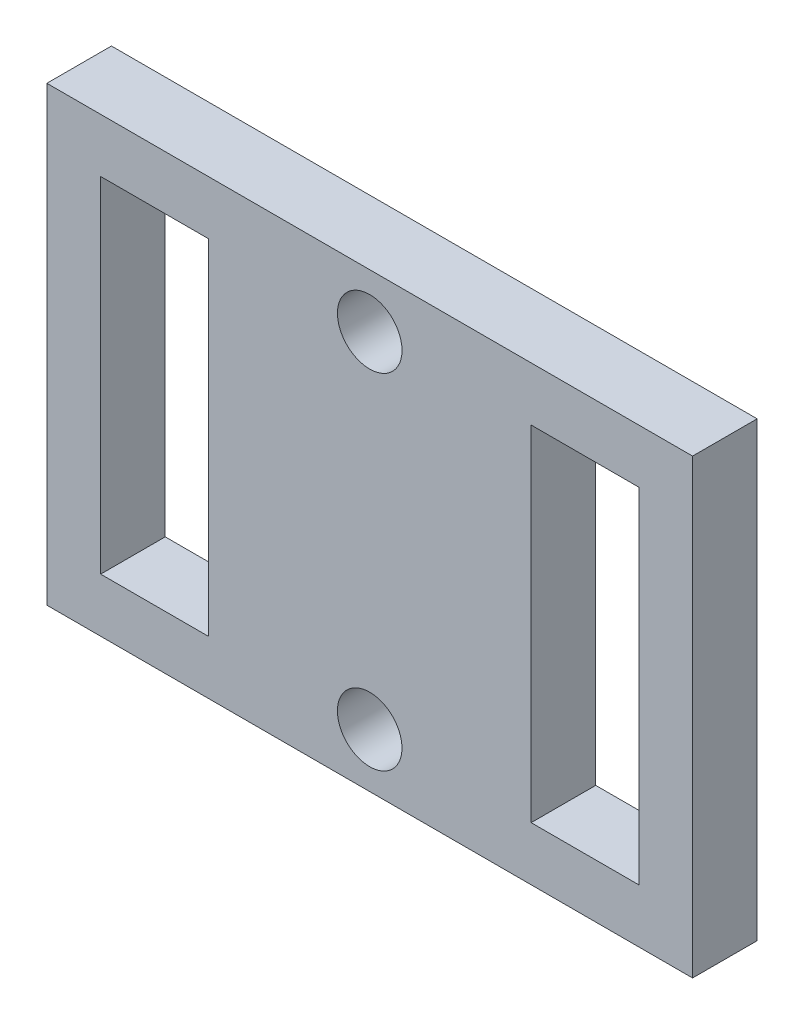
ISO-10303-21;
HEADER;
FILE_DESCRIPTION(('STEP AP214'),'2;1');
FILE_NAME('part.step','',(''),(''),'','','');
FILE_SCHEMA(('AUTOMOTIVE_DESIGN { 1 0 10303 214 1 1 1 1 }'));
ENDSEC;
DATA;
#1=APPLICATION_CONTEXT('core data for automotive mechanical design processes');
#2=APPLICATION_PROTOCOL_DEFINITION('international standard','automotive_design',2000,#1);
#3=PRODUCT_CONTEXT('',#1,'mechanical');
#4=PRODUCT('Part','Part','',(#3));
#5=PRODUCT_RELATED_PRODUCT_CATEGORY('part','',(#4));
#6=PRODUCT_DEFINITION_FORMATION('','',#4);
#7=PRODUCT_DEFINITION_CONTEXT('part definition',#1,'design');
#8=PRODUCT_DEFINITION('design','',#6,#7);
#9=PRODUCT_DEFINITION_SHAPE('','',#8);
#10=(LENGTH_UNIT() NAMED_UNIT(*) SI_UNIT(.MILLI.,.METRE.));
#11=(NAMED_UNIT(*) PLANE_ANGLE_UNIT() SI_UNIT($,.RADIAN.));
#12=(NAMED_UNIT(*) SI_UNIT($,.STERADIAN.) SOLID_ANGLE_UNIT());
#13=UNCERTAINTY_MEASURE_WITH_UNIT(LENGTH_MEASURE(1.E-05),#10,'distance_accuracy_value','');
#14=(GEOMETRIC_REPRESENTATION_CONTEXT(3) GLOBAL_UNCERTAINTY_ASSIGNED_CONTEXT((#13)) GLOBAL_UNIT_ASSIGNED_CONTEXT((#10,
#11,#12)) REPRESENTATION_CONTEXT('',''));
#15=CARTESIAN_POINT('',(0.,0.,0.));
#16=DIRECTION('',(0.,0.,1.));
#17=DIRECTION('',(1.,0.,0.));
#18=AXIS2_PLACEMENT_3D('',#15,#16,#17);
#19=CARTESIAN_POINT('',(0.,0.,3.));
#20=DIRECTION('',(0.,0.,1.));
#21=DIRECTION('',(1.,0.,0.));
#22=AXIS2_PLACEMENT_3D('',#19,#20,#21);
#23=PLANE('',#22);
#24=DIRECTION('',(0.,1.,0.));
#25=VECTOR('',#24,1.);
#26=CARTESIAN_POINT('',(-7.5,8.,3.));
#27=LINE('',#26,#25);
#28=CARTESIAN_POINT('',(-7.5,-8.,3.));
#29=VERTEX_POINT('',#28);
#30=CARTESIAN_POINT('',(-7.5,8.,3.));
#31=VERTEX_POINT('',#30);
#32=EDGE_CURVE('E55',#29,#31,#27,.T.);
#33=ORIENTED_EDGE('',*,*,#32,.F.);
#34=DIRECTION('',(1.,0.,0.));
#35=VECTOR('',#34,1.);
#36=CARTESIAN_POINT('',(-12.5,-8.,3.));
#37=LINE('',#36,#35);
#38=CARTESIAN_POINT('',(-12.5,-8.,3.));
#39=VERTEX_POINT('',#38);
#40=EDGE_CURVE('E153',#39,#29,#37,.T.);
#41=ORIENTED_EDGE('',*,*,#40,.F.);
#42=DIRECTION('',(0.,-1.,0.));
#43=VECTOR('',#42,1.);
#44=CARTESIAN_POINT('',(-12.5,8.,3.));
#45=LINE('',#44,#43);
#46=CARTESIAN_POINT('',(-12.5,8.,3.));
#47=VERTEX_POINT('',#46);
#48=EDGE_CURVE('E157',#47,#39,#45,.T.);
#49=ORIENTED_EDGE('',*,*,#48,.F.);
#50=DIRECTION('',(-1.,0.,0.));
#51=VECTOR('',#50,1.);
#52=CARTESIAN_POINT('',(-12.5,8.,3.));
#53=LINE('',#52,#51);
#54=EDGE_CURVE('E166',#31,#47,#53,.T.);
#55=ORIENTED_EDGE('',*,*,#54,.F.);
#56=EDGE_LOOP('',(#33,#41,#49,#55));
#57=FACE_BOUND('',#56,.T.);
#58=DIRECTION('',(0.,1.,0.));
#59=VECTOR('',#58,1.);
#60=CARTESIAN_POINT('',(12.5,8.,3.));
#61=LINE('',#60,#59);
#62=CARTESIAN_POINT('',(12.5,-8.,3.));
#63=VERTEX_POINT('',#62);
#64=CARTESIAN_POINT('',(12.5,8.,3.));
#65=VERTEX_POINT('',#64);
#66=EDGE_CURVE('E63',#63,#65,#61,.T.);
#67=ORIENTED_EDGE('',*,*,#66,.F.);
#68=DIRECTION('',(1.,0.,0.));
#69=VECTOR('',#68,1.);
#70=CARTESIAN_POINT('',(12.5,-8.,3.));
#71=LINE('',#70,#69);
#72=CARTESIAN_POINT('',(7.5,-8.,3.));
#73=VERTEX_POINT('',#72);
#74=EDGE_CURVE('E187',#73,#63,#71,.T.);
#75=ORIENTED_EDGE('',*,*,#74,.F.);
#76=DIRECTION('',(0.,-1.,0.));
#77=VECTOR('',#76,1.);
#78=CARTESIAN_POINT('',(7.5,8.,3.));
#79=LINE('',#78,#77);
#80=CARTESIAN_POINT('',(7.5,8.,3.));
#81=VERTEX_POINT('',#80);
#82=EDGE_CURVE('E206',#81,#73,#79,.T.);
#83=ORIENTED_EDGE('',*,*,#82,.F.);
#84=DIRECTION('',(-1.,0.,0.));
#85=VECTOR('',#84,1.);
#86=CARTESIAN_POINT('',(12.5,8.,3.));
#87=LINE('',#86,#85);
#88=EDGE_CURVE('E202',#65,#81,#87,.T.);
#89=ORIENTED_EDGE('',*,*,#88,.F.);
#90=EDGE_LOOP('',(#67,#75,#83,#89));
#91=FACE_BOUND('',#90,.T.);
#92=CARTESIAN_POINT('',(0.,8.,3.));
#93=DIRECTION('',(0.,0.,1.));
#94=DIRECTION('',(1.,0.,0.));
#95=AXIS2_PLACEMENT_3D('',#92,#93,#94);
#96=CIRCLE('',#95,1.5);
#97=CARTESIAN_POINT('',(1.5,8.,3.));
#98=VERTEX_POINT('',#97);
#99=EDGE_CURVE('E231',#98,#98,#96,.T.);
#100=ORIENTED_EDGE('',*,*,#99,.F.);
#101=EDGE_LOOP('',(#100));
#102=FACE_BOUND('',#101,.T.);
#103=DIRECTION('',(0.,1.,0.));
#104=VECTOR('',#103,1.);
#105=CARTESIAN_POINT('',(15.,10.5,3.));
#106=LINE('',#105,#104);
#107=CARTESIAN_POINT('',(15.,-10.5,3.));
#108=VERTEX_POINT('',#107);
#109=CARTESIAN_POINT('',(15.,10.5,3.));
#110=VERTEX_POINT('',#109);
#111=EDGE_CURVE('E239',#108,#110,#106,.T.);
#112=ORIENTED_EDGE('',*,*,#111,.T.);
#113=DIRECTION('',(-1.,0.,0.));
#114=VECTOR('',#113,1.);
#115=CARTESIAN_POINT('',(-15.,10.5,3.));
#116=LINE('',#115,#114);
#117=CARTESIAN_POINT('',(-15.,10.5,3.));
#118=VERTEX_POINT('',#117);
#119=EDGE_CURVE('E243',#110,#118,#116,.T.);
#120=ORIENTED_EDGE('',*,*,#119,.T.);
#121=DIRECTION('',(0.,-1.,0.));
#122=VECTOR('',#121,1.);
#123=CARTESIAN_POINT('',(-15.,10.5,3.));
#124=LINE('',#123,#122);
#125=CARTESIAN_POINT('',(-15.,-10.5,3.));
#126=VERTEX_POINT('',#125);
#127=EDGE_CURVE('E247',#118,#126,#124,.T.);
#128=ORIENTED_EDGE('',*,*,#127,.T.);
#129=DIRECTION('',(1.,0.,0.));
#130=VECTOR('',#129,1.);
#131=CARTESIAN_POINT('',(-15.,-10.5,3.));
#132=LINE('',#131,#130);
#133=EDGE_CURVE('E250',#126,#108,#132,.T.);
#134=ORIENTED_EDGE('',*,*,#133,.T.);
#135=EDGE_LOOP('',(#112,#120,#128,#134));
#136=FACE_BOUND('',#135,.T.);
#137=CARTESIAN_POINT('',(0.,-7.99999999999999,3.));
#138=DIRECTION('',(0.,0.,1.));
#139=DIRECTION('',(-1.,0.,0.));
#140=AXIS2_PLACEMENT_3D('',#137,#138,#139);
#141=CIRCLE('',#140,1.5);
#142=CARTESIAN_POINT('',(-1.50000000000001,-7.99999999999999,3.));
#143=VERTEX_POINT('',#142);
#144=EDGE_CURVE('E223',#143,#143,#141,.T.);
#145=ORIENTED_EDGE('',*,*,#144,.F.);
#146=EDGE_LOOP('',(#145));
#147=FACE_BOUND('',#146,.T.);
#148=ADVANCED_FACE('F39',(#57,#91,#102,#136,#147),#23,.T.);
#149=CARTESIAN_POINT('',(0.,0.,0.));
#150=DIRECTION('',(0.,0.,1.));
#151=DIRECTION('',(1.,0.,0.));
#152=AXIS2_PLACEMENT_3D('',#149,#150,#151);
#153=PLANE('',#152);
#154=DIRECTION('',(1.,0.,0.));
#155=VECTOR('',#154,1.);
#156=CARTESIAN_POINT('',(-12.5,-8.,0.));
#157=LINE('',#156,#155);
#158=CARTESIAN_POINT('',(-12.5,-8.,0.));
#159=VERTEX_POINT('',#158);
#160=CARTESIAN_POINT('',(-7.5,-8.,0.));
#161=VERTEX_POINT('',#160);
#162=EDGE_CURVE('E138',#159,#161,#157,.T.);
#163=ORIENTED_EDGE('',*,*,#162,.T.);
#164=DIRECTION('',(0.,1.,0.));
#165=VECTOR('',#164,1.);
#166=CARTESIAN_POINT('',(-7.5,8.,0.));
#167=LINE('',#166,#165);
#168=CARTESIAN_POINT('',(-7.5,8.,0.));
#169=VERTEX_POINT('',#168);
#170=EDGE_CURVE('E131',#161,#169,#167,.T.);
#171=ORIENTED_EDGE('',*,*,#170,.T.);
#172=DIRECTION('',(-1.,0.,0.));
#173=VECTOR('',#172,1.);
#174=CARTESIAN_POINT('',(-12.5,8.,0.));
#175=LINE('',#174,#173);
#176=CARTESIAN_POINT('',(-12.5,8.,0.));
#177=VERTEX_POINT('',#176);
#178=EDGE_CURVE('E142',#169,#177,#175,.T.);
#179=ORIENTED_EDGE('',*,*,#178,.T.);
#180=DIRECTION('',(0.,-1.,0.));
#181=VECTOR('',#180,1.);
#182=CARTESIAN_POINT('',(-12.5,8.,0.));
#183=LINE('',#182,#181);
#184=EDGE_CURVE('E147',#177,#159,#183,.T.);
#185=ORIENTED_EDGE('',*,*,#184,.T.);
#186=EDGE_LOOP('',(#163,#171,#179,#185));
#187=FACE_BOUND('',#186,.T.);
#188=DIRECTION('',(1.,0.,0.));
#189=VECTOR('',#188,1.);
#190=CARTESIAN_POINT('',(12.5,-8.,0.));
#191=LINE('',#190,#189);
#192=CARTESIAN_POINT('',(7.5,-8.,0.));
#193=VERTEX_POINT('',#192);
#194=CARTESIAN_POINT('',(12.5,-8.,0.));
#195=VERTEX_POINT('',#194);
#196=EDGE_CURVE('E195',#193,#195,#191,.T.);
#197=ORIENTED_EDGE('',*,*,#196,.T.);
#198=DIRECTION('',(0.,1.,0.));
#199=VECTOR('',#198,1.);
#200=CARTESIAN_POINT('',(12.5,8.,0.));
#201=LINE('',#200,#199);
#202=CARTESIAN_POINT('',(12.5,8.,0.));
#203=VERTEX_POINT('',#202);
#204=EDGE_CURVE('E182',#195,#203,#201,.T.);
#205=ORIENTED_EDGE('',*,*,#204,.T.);
#206=DIRECTION('',(-1.,0.,0.));
#207=VECTOR('',#206,1.);
#208=CARTESIAN_POINT('',(12.5,8.,0.));
#209=LINE('',#208,#207);
#210=CARTESIAN_POINT('',(7.5,8.,0.));
#211=VERTEX_POINT('',#210);
#212=EDGE_CURVE('E186',#203,#211,#209,.T.);
#213=ORIENTED_EDGE('',*,*,#212,.T.);
#214=DIRECTION('',(0.,-1.,0.));
#215=VECTOR('',#214,1.);
#216=CARTESIAN_POINT('',(7.5,8.,0.));
#217=LINE('',#216,#215);
#218=EDGE_CURVE('E191',#211,#193,#217,.T.);
#219=ORIENTED_EDGE('',*,*,#218,.T.);
#220=EDGE_LOOP('',(#197,#205,#213,#219));
#221=FACE_BOUND('',#220,.T.);
#222=DIRECTION('',(0.,1.,0.));
#223=VECTOR('',#222,1.);
#224=CARTESIAN_POINT('',(15.,10.5,0.));
#225=LINE('',#224,#223);
#226=CARTESIAN_POINT('',(15.,-10.5,0.));
#227=VERTEX_POINT('',#226);
#228=CARTESIAN_POINT('',(15.,10.5,0.));
#229=VERTEX_POINT('',#228);
#230=EDGE_CURVE('E235',#227,#229,#225,.T.);
#231=ORIENTED_EDGE('',*,*,#230,.F.);
#232=DIRECTION('',(1.,0.,0.));
#233=VECTOR('',#232,1.);
#234=CARTESIAN_POINT('',(-15.,-10.5,0.));
#235=LINE('',#234,#233);
#236=CARTESIAN_POINT('',(-15.,-10.5,0.));
#237=VERTEX_POINT('',#236);
#238=EDGE_CURVE('E244',#237,#227,#235,.T.);
#239=ORIENTED_EDGE('',*,*,#238,.F.);
#240=DIRECTION('',(0.,-1.,0.));
#241=VECTOR('',#240,1.);
#242=CARTESIAN_POINT('',(-15.,10.5,0.));
#243=LINE('',#242,#241);
#244=CARTESIAN_POINT('',(-15.,10.5,0.));
#245=VERTEX_POINT('',#244);
#246=EDGE_CURVE('E260',#245,#237,#243,.T.);
#247=ORIENTED_EDGE('',*,*,#246,.F.);
#248=DIRECTION('',(-1.,0.,0.));
#249=VECTOR('',#248,1.);
#250=CARTESIAN_POINT('',(-15.,10.5,0.));
#251=LINE('',#250,#249);
#252=EDGE_CURVE('E257',#229,#245,#251,.T.);
#253=ORIENTED_EDGE('',*,*,#252,.F.);
#254=EDGE_LOOP('',(#231,#239,#247,#253));
#255=FACE_BOUND('',#254,.T.);
#256=CARTESIAN_POINT('',(0.,8.,0.));
#257=DIRECTION('',(0.,0.,1.));
#258=DIRECTION('',(1.,0.,0.));
#259=AXIS2_PLACEMENT_3D('',#256,#257,#258);
#260=CIRCLE('',#259,1.5);
#261=CARTESIAN_POINT('',(1.5,8.,0.));
#262=VERTEX_POINT('',#261);
#263=EDGE_CURVE('E227',#262,#262,#260,.T.);
#264=ORIENTED_EDGE('',*,*,#263,.T.);
#265=EDGE_LOOP('',(#264));
#266=FACE_BOUND('',#265,.T.);
#267=CARTESIAN_POINT('',(0.,-7.99999999999999,0.));
#268=DIRECTION('',(0.,0.,1.));
#269=DIRECTION('',(-1.,0.,0.));
#270=AXIS2_PLACEMENT_3D('',#267,#268,#269);
#271=CIRCLE('',#270,1.5);
#272=CARTESIAN_POINT('',(-1.50000000000001,-7.99999999999999,0.));
#273=VERTEX_POINT('',#272);
#274=EDGE_CURVE('E176',#273,#273,#271,.T.);
#275=ORIENTED_EDGE('',*,*,#274,.T.);
#276=EDGE_LOOP('',(#275));
#277=FACE_BOUND('',#276,.T.);
#278=ADVANCED_FACE('F149',(#187,#221,#255,#266,#277),#153,.F.);
#279=CARTESIAN_POINT('',(15.,10.5,3.));
#280=DIRECTION('',(-1.,0.,0.));
#281=DIRECTION('',(0.,-1.,0.));
#282=AXIS2_PLACEMENT_3D('',#279,#280,#281);
#283=PLANE('',#282);
#284=ORIENTED_EDGE('',*,*,#230,.T.);
#285=DIRECTION('',(0.,0.,-1.));
#286=VECTOR('',#285,1.);
#287=CARTESIAN_POINT('',(15.,10.5,3.));
#288=LINE('',#287,#286);
#289=EDGE_CURVE('E11',#110,#229,#288,.T.);
#290=ORIENTED_EDGE('',*,*,#289,.F.);
#291=ORIENTED_EDGE('',*,*,#111,.F.);
#292=DIRECTION('',(0.,0.,-1.));
#293=VECTOR('',#292,1.);
#294=CARTESIAN_POINT('',(15.,-10.5,3.));
#295=LINE('',#294,#293);
#296=EDGE_CURVE('E253',#108,#227,#295,.T.);
#297=ORIENTED_EDGE('',*,*,#296,.T.);
#298=EDGE_LOOP('',(#284,#290,#291,#297));
#299=FACE_BOUND('',#298,.T.);
#300=ADVANCED_FACE('F41',(#299),#283,.F.);
#301=CARTESIAN_POINT('',(-15.,10.5,3.));
#302=DIRECTION('',(0.,-1.,0.));
#303=DIRECTION('',(0.,0.,-1.));
#304=AXIS2_PLACEMENT_3D('',#301,#302,#303);
#305=PLANE('',#304);
#306=ORIENTED_EDGE('',*,*,#252,.T.);
#307=DIRECTION('',(0.,0.,-1.));
#308=VECTOR('',#307,1.);
#309=CARTESIAN_POINT('',(-15.,10.5,3.));
#310=LINE('',#309,#308);
#311=EDGE_CURVE('E48',#118,#245,#310,.T.);
#312=ORIENTED_EDGE('',*,*,#311,.F.);
#313=ORIENTED_EDGE('',*,*,#119,.F.);
#314=ORIENTED_EDGE('',*,*,#289,.T.);
#315=EDGE_LOOP('',(#306,#312,#313,#314));
#316=FACE_BOUND('',#315,.T.);
#317=ADVANCED_FACE('F293',(#316),#305,.F.);
#318=CARTESIAN_POINT('',(-15.,10.5,3.));
#319=DIRECTION('',(1.,0.,0.));
#320=DIRECTION('',(0.,0.,-1.));
#321=AXIS2_PLACEMENT_3D('',#318,#319,#320);
#322=PLANE('',#321);
#323=ORIENTED_EDGE('',*,*,#246,.T.);
#324=DIRECTION('',(0.,0.,-1.));
#325=VECTOR('',#324,1.);
#326=CARTESIAN_POINT('',(-15.,-10.5,3.));
#327=LINE('',#326,#325);
#328=EDGE_CURVE('E268',#126,#237,#327,.T.);
#329=ORIENTED_EDGE('',*,*,#328,.F.);
#330=ORIENTED_EDGE('',*,*,#127,.F.);
#331=ORIENTED_EDGE('',*,*,#311,.T.);
#332=EDGE_LOOP('',(#323,#329,#330,#331));
#333=FACE_BOUND('',#332,.T.);
#334=ADVANCED_FACE('F277',(#333),#322,.F.);
#335=CARTESIAN_POINT('',(-15.,-10.5,3.));
#336=DIRECTION('',(0.,1.,0.));
#337=DIRECTION('',(0.,0.,1.));
#338=AXIS2_PLACEMENT_3D('',#335,#336,#337);
#339=PLANE('',#338);
#340=ORIENTED_EDGE('',*,*,#238,.T.);
#341=ORIENTED_EDGE('',*,*,#296,.F.);
#342=ORIENTED_EDGE('',*,*,#133,.F.);
#343=ORIENTED_EDGE('',*,*,#328,.T.);
#344=EDGE_LOOP('',(#340,#341,#342,#343));
#345=FACE_BOUND('',#344,.T.);
#346=ADVANCED_FACE('F286',(#345),#339,.F.);
#347=CARTESIAN_POINT('',(0.,8.,3.));
#348=DIRECTION('',(0.,0.,-1.));
#349=DIRECTION('',(-1.,0.,0.));
#350=AXIS2_PLACEMENT_3D('',#347,#348,#349);
#351=CYLINDRICAL_SURFACE('',#350,1.5);
#352=ORIENTED_EDGE('',*,*,#99,.T.);
#353=EDGE_LOOP('',(#352));
#354=FACE_BOUND('',#353,.T.);
#355=ORIENTED_EDGE('',*,*,#263,.F.);
#356=EDGE_LOOP('',(#355));
#357=FACE_BOUND('',#356,.T.);
#358=ADVANCED_FACE('F309',(#354,#357),#351,.F.);
#359=CARTESIAN_POINT('',(0.,-7.99999999999999,3.));
#360=DIRECTION('',(0.,0.,-1.));
#361=DIRECTION('',(-1.,0.,0.));
#362=AXIS2_PLACEMENT_3D('',#359,#360,#361);
#363=CYLINDRICAL_SURFACE('',#362,1.5);
#364=ORIENTED_EDGE('',*,*,#144,.T.);
#365=EDGE_LOOP('',(#364));
#366=FACE_BOUND('',#365,.T.);
#367=ORIENTED_EDGE('',*,*,#274,.F.);
#368=EDGE_LOOP('',(#367));
#369=FACE_BOUND('',#368,.T.);
#370=ADVANCED_FACE('F316',(#366,#369),#363,.F.);
#371=CARTESIAN_POINT('',(12.5,8.,0.));
#372=DIRECTION('',(1.,0.,0.));
#373=DIRECTION('',(0.,0.,-1.));
#374=AXIS2_PLACEMENT_3D('',#371,#372,#373);
#375=PLANE('',#374);
#376=ORIENTED_EDGE('',*,*,#66,.T.);
#377=DIRECTION('',(0.,0.,1.));
#378=VECTOR('',#377,1.);
#379=CARTESIAN_POINT('',(12.5,8.,0.));
#380=LINE('',#379,#378);
#381=EDGE_CURVE('E199',#203,#65,#380,.T.);
#382=ORIENTED_EDGE('',*,*,#381,.F.);
#383=ORIENTED_EDGE('',*,*,#204,.F.);
#384=DIRECTION('',(0.,0.,1.));
#385=VECTOR('',#384,1.);
#386=CARTESIAN_POINT('',(12.5,-8.,0.));
#387=LINE('',#386,#385);
#388=EDGE_CURVE('E167',#195,#63,#387,.T.);
#389=ORIENTED_EDGE('',*,*,#388,.T.);
#390=EDGE_LOOP('',(#376,#382,#383,#389));
#391=FACE_BOUND('',#390,.T.);
#392=ADVANCED_FACE('F321',(#391),#375,.F.);
#393=CARTESIAN_POINT('',(12.5,-8.,0.));
#394=DIRECTION('',(0.,-1.,0.));
#395=DIRECTION('',(1.,0.,0.));
#396=AXIS2_PLACEMENT_3D('',#393,#394,#395);
#397=PLANE('',#396);
#398=ORIENTED_EDGE('',*,*,#74,.T.);
#399=ORIENTED_EDGE('',*,*,#388,.F.);
#400=ORIENTED_EDGE('',*,*,#196,.F.);
#401=DIRECTION('',(0.,0.,1.));
#402=VECTOR('',#401,1.);
#403=CARTESIAN_POINT('',(7.5,-8.,0.));
#404=LINE('',#403,#402);
#405=EDGE_CURVE('E215',#193,#73,#404,.T.);
#406=ORIENTED_EDGE('',*,*,#405,.T.);
#407=EDGE_LOOP('',(#398,#399,#400,#406));
#408=FACE_BOUND('',#407,.T.);
#409=ADVANCED_FACE('F333',(#408),#397,.F.);
#410=CARTESIAN_POINT('',(7.5,8.,0.));
#411=DIRECTION('',(-1.,0.,0.));
#412=DIRECTION('',(0.,0.,1.));
#413=AXIS2_PLACEMENT_3D('',#410,#411,#412);
#414=PLANE('',#413);
#415=ORIENTED_EDGE('',*,*,#82,.T.);
#416=ORIENTED_EDGE('',*,*,#405,.F.);
#417=ORIENTED_EDGE('',*,*,#218,.F.);
#418=DIRECTION('',(0.,0.,1.));
#419=VECTOR('',#418,1.);
#420=CARTESIAN_POINT('',(7.5,8.,0.));
#421=LINE('',#420,#419);
#422=EDGE_CURVE('E218',#211,#81,#421,.T.);
#423=ORIENTED_EDGE('',*,*,#422,.T.);
#424=EDGE_LOOP('',(#415,#416,#417,#423));
#425=FACE_BOUND('',#424,.T.);
#426=ADVANCED_FACE('F339',(#425),#414,.F.);
#427=CARTESIAN_POINT('',(12.5,8.,0.));
#428=DIRECTION('',(0.,1.,0.));
#429=DIRECTION('',(-1.,0.,0.));
#430=AXIS2_PLACEMENT_3D('',#427,#428,#429);
#431=PLANE('',#430);
#432=ORIENTED_EDGE('',*,*,#88,.T.);
#433=ORIENTED_EDGE('',*,*,#422,.F.);
#434=ORIENTED_EDGE('',*,*,#212,.F.);
#435=ORIENTED_EDGE('',*,*,#381,.T.);
#436=EDGE_LOOP('',(#432,#433,#434,#435));
#437=FACE_BOUND('',#436,.T.);
#438=ADVANCED_FACE('F336',(#437),#431,.F.);
#439=CARTESIAN_POINT('',(-7.5,8.,0.));
#440=DIRECTION('',(1.,0.,0.));
#441=DIRECTION('',(0.,1.,0.));
#442=AXIS2_PLACEMENT_3D('',#439,#440,#441);
#443=PLANE('',#442);
#444=ORIENTED_EDGE('',*,*,#32,.T.);
#445=DIRECTION('',(0.,0.,1.));
#446=VECTOR('',#445,1.);
#447=CARTESIAN_POINT('',(-7.5,8.,0.));
#448=LINE('',#447,#446);
#449=EDGE_CURVE('E127',#169,#31,#448,.T.);
#450=ORIENTED_EDGE('',*,*,#449,.F.);
#451=ORIENTED_EDGE('',*,*,#170,.F.);
#452=DIRECTION('',(0.,0.,1.));
#453=VECTOR('',#452,1.);
#454=CARTESIAN_POINT('',(-7.5,-8.,0.));
#455=LINE('',#454,#453);
#456=EDGE_CURVE('E173',#161,#29,#455,.T.);
#457=ORIENTED_EDGE('',*,*,#456,.T.);
#458=EDGE_LOOP('',(#444,#450,#451,#457));
#459=FACE_BOUND('',#458,.T.);
#460=ADVANCED_FACE('F129',(#459),#443,.F.);
#461=CARTESIAN_POINT('',(-12.5,-8.,0.));
#462=DIRECTION('',(0.,-1.,0.));
#463=DIRECTION('',(0.,0.,-1.));
#464=AXIS2_PLACEMENT_3D('',#461,#462,#463);
#465=PLANE('',#464);
#466=ORIENTED_EDGE('',*,*,#40,.T.);
#467=ORIENTED_EDGE('',*,*,#456,.F.);
#468=ORIENTED_EDGE('',*,*,#162,.F.);
#469=DIRECTION('',(0.,0.,1.));
#470=VECTOR('',#469,1.);
#471=CARTESIAN_POINT('',(-12.5,-8.,0.));
#472=LINE('',#471,#470);
#473=EDGE_CURVE('E177',#159,#39,#472,.T.);
#474=ORIENTED_EDGE('',*,*,#473,.T.);
#475=EDGE_LOOP('',(#466,#467,#468,#474));
#476=FACE_BOUND('',#475,.T.);
#477=ADVANCED_FACE('F349',(#476),#465,.F.);
#478=CARTESIAN_POINT('',(-12.5,8.,0.));
#479=DIRECTION('',(-1.,0.,0.));
#480=DIRECTION('',(0.,-1.,0.));
#481=AXIS2_PLACEMENT_3D('',#478,#479,#480);
#482=PLANE('',#481);
#483=ORIENTED_EDGE('',*,*,#48,.T.);
#484=ORIENTED_EDGE('',*,*,#473,.F.);
#485=ORIENTED_EDGE('',*,*,#184,.F.);
#486=DIRECTION('',(0.,0.,1.));
#487=VECTOR('',#486,1.);
#488=CARTESIAN_POINT('',(-12.5,8.,0.));
#489=LINE('',#488,#487);
#490=EDGE_CURVE('E137',#177,#47,#489,.T.);
#491=ORIENTED_EDGE('',*,*,#490,.T.);
#492=EDGE_LOOP('',(#483,#484,#485,#491));
#493=FACE_BOUND('',#492,.T.);
#494=ADVANCED_FACE('F352',(#493),#482,.F.);
#495=CARTESIAN_POINT('',(-12.5,8.,0.));
#496=DIRECTION('',(0.,1.,0.));
#497=DIRECTION('',(0.,0.,1.));
#498=AXIS2_PLACEMENT_3D('',#495,#496,#497);
#499=PLANE('',#498);
#500=ORIENTED_EDGE('',*,*,#54,.T.);
#501=ORIENTED_EDGE('',*,*,#490,.F.);
#502=ORIENTED_EDGE('',*,*,#178,.F.);
#503=ORIENTED_EDGE('',*,*,#449,.T.);
#504=EDGE_LOOP('',(#500,#501,#502,#503));
#505=FACE_BOUND('',#504,.T.);
#506=ADVANCED_FACE('F143',(#505),#499,.F.);
#507=CLOSED_SHELL('',(#148,#278,#300,#317,#334,#346,#358,#370,#392,#409,#426,#438,#460,#477,
#494,#506));
#508=MANIFOLD_SOLID_BREP('B2',#507);
#509=ADVANCED_BREP_SHAPE_REPRESENTATION('',(#18,#508),#14);
#510=SHAPE_DEFINITION_REPRESENTATION(#9,#509);
ENDSEC;
END-ISO-10303-21;
